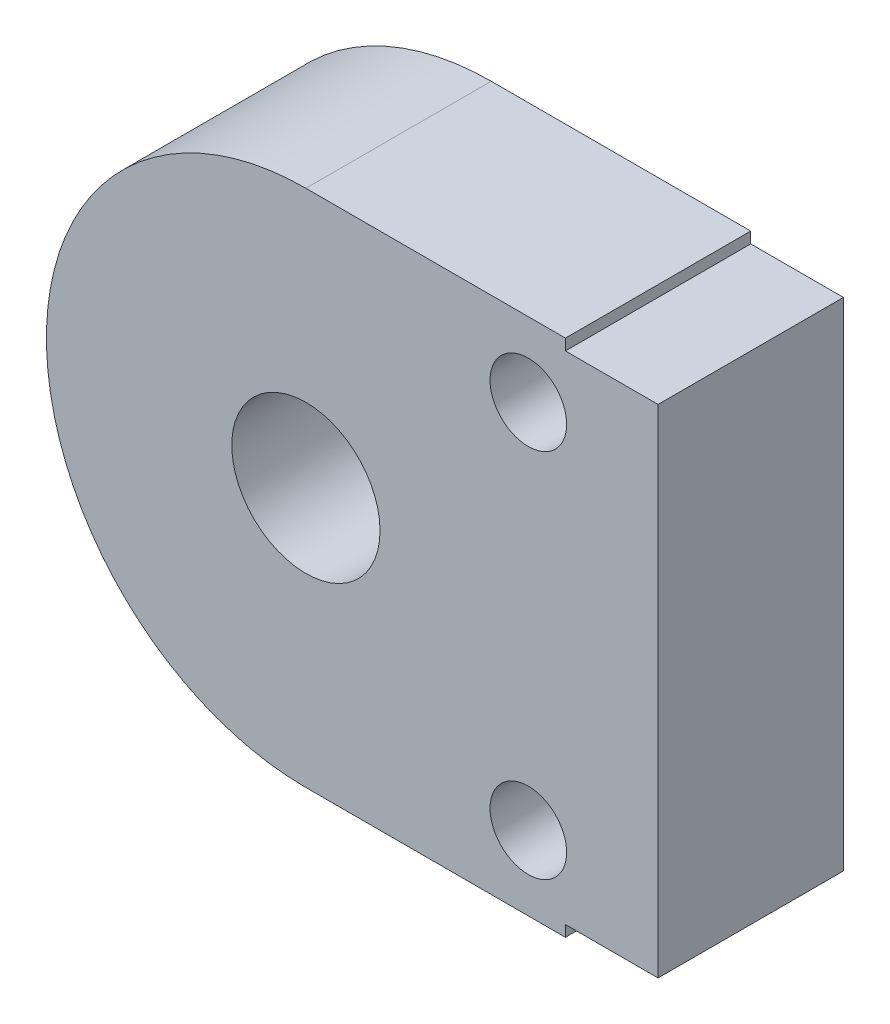
ISO-10303-21;
HEADER;
FILE_DESCRIPTION(('STEP AP214'),'2;1');
FILE_NAME('part.step','',(''),(''),'','','');
FILE_SCHEMA(('AUTOMOTIVE_DESIGN { 1 0 10303 214 1 1 1 1 }'));
ENDSEC;
DATA;
#1=APPLICATION_CONTEXT('core data for automotive mechanical design processes');
#2=APPLICATION_PROTOCOL_DEFINITION('international standard','automotive_design',2000,#1);
#3=PRODUCT_CONTEXT('',#1,'mechanical');
#4=PRODUCT('Part','Part','',(#3));
#5=PRODUCT_RELATED_PRODUCT_CATEGORY('part','',(#4));
#6=PRODUCT_DEFINITION_FORMATION('','',#4);
#7=PRODUCT_DEFINITION_CONTEXT('part definition',#1,'design');
#8=PRODUCT_DEFINITION('design','',#6,#7);
#9=PRODUCT_DEFINITION_SHAPE('','',#8);
#10=(LENGTH_UNIT() NAMED_UNIT(*) SI_UNIT(.MILLI.,.METRE.));
#11=(NAMED_UNIT(*) PLANE_ANGLE_UNIT() SI_UNIT($,.RADIAN.));
#12=(NAMED_UNIT(*) SI_UNIT($,.STERADIAN.) SOLID_ANGLE_UNIT());
#13=UNCERTAINTY_MEASURE_WITH_UNIT(LENGTH_MEASURE(1.E-05),#10,'distance_accuracy_value','');
#14=(GEOMETRIC_REPRESENTATION_CONTEXT(3) GLOBAL_UNCERTAINTY_ASSIGNED_CONTEXT((#13)) GLOBAL_UNIT_ASSIGNED_CONTEXT((#10,
#11,#12)) REPRESENTATION_CONTEXT('',''));
#15=CARTESIAN_POINT('',(0.,0.,0.));
#16=DIRECTION('',(0.,0.,1.));
#17=DIRECTION('',(1.,0.,0.));
#18=AXIS2_PLACEMENT_3D('',#15,#16,#17);
#19=CARTESIAN_POINT('',(0.,0.,-53.2781700167648));
#20=DIRECTION('',(0.,0.,1.));
#21=DIRECTION('',(1.,0.,0.));
#22=AXIS2_PLACEMENT_3D('',#19,#20,#21);
#23=CYLINDRICAL_SURFACE('',#22,14.);
#24=CARTESIAN_POINT('',(0.,0.,-10.));
#25=DIRECTION('',(0.,0.,1.));
#26=DIRECTION('',(1.,0.,0.));
#27=AXIS2_PLACEMENT_3D('',#24,#25,#26);
#28=CIRCLE('',#27,14.);
#29=CARTESIAN_POINT('',(0.,-14.,-10.));
#30=VERTEX_POINT('',#29);
#31=CARTESIAN_POINT('',(0.,14.,-10.));
#32=VERTEX_POINT('',#31);
#33=EDGE_CURVE('E23',#30,#32,#28,.F.);
#34=ORIENTED_EDGE('',*,*,#33,.F.);
#35=DIRECTION('',(0.,0.,1.));
#36=VECTOR('',#35,1.);
#37=CARTESIAN_POINT('',(0.,-14.,-53.2781700167648));
#38=LINE('',#37,#36);
#39=CARTESIAN_POINT('',(0.,-14.,0.));
#40=VERTEX_POINT('',#39);
#41=EDGE_CURVE('E81',#30,#40,#38,.T.);
#42=ORIENTED_EDGE('',*,*,#41,.T.);
#43=CARTESIAN_POINT('',(0.,0.,0.));
#44=DIRECTION('',(0.,0.,1.));
#45=DIRECTION('',(1.,0.,0.));
#46=AXIS2_PLACEMENT_3D('',#43,#44,#45);
#47=CIRCLE('',#46,14.);
#48=CARTESIAN_POINT('',(0.,14.,0.));
#49=VERTEX_POINT('',#48);
#50=EDGE_CURVE('E84',#49,#40,#47,.T.);
#51=ORIENTED_EDGE('',*,*,#50,.F.);
#52=DIRECTION('',(0.,0.,1.));
#53=VECTOR('',#52,1.);
#54=CARTESIAN_POINT('',(0.,14.,-53.2781700167648));
#55=LINE('',#54,#53);
#56=EDGE_CURVE('E57',#32,#49,#55,.T.);
#57=ORIENTED_EDGE('',*,*,#56,.F.);
#58=EDGE_LOOP('',(#34,#42,#51,#57));
#59=FACE_BOUND('',#58,.T.);
#60=ADVANCED_FACE('F15',(#59),#23,.T.);
#61=CARTESIAN_POINT('',(0.,14.,-53.2781700167648));
#62=DIRECTION('',(0.,1.,0.));
#63=DIRECTION('',(0.,0.,1.));
#64=AXIS2_PLACEMENT_3D('',#61,#62,#63);
#65=PLANE('',#64);
#66=DIRECTION('',(1.,0.,0.));
#67=VECTOR('',#66,1.);
#68=CARTESIAN_POINT('',(0.,14.,-10.));
#69=LINE('',#68,#67);
#70=CARTESIAN_POINT('',(14.,14.,-10.));
#71=VERTEX_POINT('',#70);
#72=EDGE_CURVE('E157',#32,#71,#69,.T.);
#73=ORIENTED_EDGE('',*,*,#72,.F.);
#74=ORIENTED_EDGE('',*,*,#56,.T.);
#75=DIRECTION('',(-1.,0.,0.));
#76=VECTOR('',#75,1.);
#77=CARTESIAN_POINT('',(0.,14.,0.));
#78=LINE('',#77,#76);
#79=CARTESIAN_POINT('',(14.,14.,0.));
#80=VERTEX_POINT('',#79);
#81=EDGE_CURVE('E88',#80,#49,#78,.T.);
#82=ORIENTED_EDGE('',*,*,#81,.F.);
#83=DIRECTION('',(0.,0.,1.));
#84=VECTOR('',#83,1.);
#85=CARTESIAN_POINT('',(14.,14.,-53.2781700167648));
#86=LINE('',#85,#84);
#87=EDGE_CURVE('E121',#71,#80,#86,.T.);
#88=ORIENTED_EDGE('',*,*,#87,.F.);
#89=EDGE_LOOP('',(#73,#74,#82,#88));
#90=FACE_BOUND('',#89,.T.);
#91=ADVANCED_FACE('F156',(#90),#65,.T.);
#92=CARTESIAN_POINT('',(14.,14.,-53.2781700167648));
#93=DIRECTION('',(1.,0.,0.));
#94=DIRECTION('',(0.,1.,0.));
#95=AXIS2_PLACEMENT_3D('',#92,#93,#94);
#96=PLANE('',#95);
#97=DIRECTION('',(0.,-1.,0.));
#98=VECTOR('',#97,1.);
#99=CARTESIAN_POINT('',(14.,14.,-10.));
#100=LINE('',#99,#98);
#101=CARTESIAN_POINT('',(14.,13.4,-10.));
#102=VERTEX_POINT('',#101);
#103=EDGE_CURVE('E158',#71,#102,#100,.T.);
#104=ORIENTED_EDGE('',*,*,#103,.F.);
#105=ORIENTED_EDGE('',*,*,#87,.T.);
#106=DIRECTION('',(0.,1.,0.));
#107=VECTOR('',#106,1.);
#108=CARTESIAN_POINT('',(14.,14.,0.));
#109=LINE('',#108,#107);
#110=CARTESIAN_POINT('',(14.,13.4,0.));
#111=VERTEX_POINT('',#110);
#112=EDGE_CURVE('E117',#111,#80,#109,.T.);
#113=ORIENTED_EDGE('',*,*,#112,.F.);
#114=DIRECTION('',(0.,0.,1.));
#115=VECTOR('',#114,1.);
#116=CARTESIAN_POINT('',(14.,13.4,-53.2781700167648));
#117=LINE('',#116,#115);
#118=EDGE_CURVE('E123',#102,#111,#117,.T.);
#119=ORIENTED_EDGE('',*,*,#118,.F.);
#120=EDGE_LOOP('',(#104,#105,#113,#119));
#121=FACE_BOUND('',#120,.T.);
#122=ADVANCED_FACE('F154',(#121),#96,.T.);
#123=CARTESIAN_POINT('',(14.,13.4,-53.2781700167648));
#124=DIRECTION('',(0.,1.,0.));
#125=DIRECTION('',(0.,0.,1.));
#126=AXIS2_PLACEMENT_3D('',#123,#124,#125);
#127=PLANE('',#126);
#128=DIRECTION('',(1.,0.,0.));
#129=VECTOR('',#128,1.);
#130=CARTESIAN_POINT('',(14.,13.4,-10.));
#131=LINE('',#130,#129);
#132=CARTESIAN_POINT('',(19.,13.4,-10.));
#133=VERTEX_POINT('',#132);
#134=EDGE_CURVE('E151',#102,#133,#131,.T.);
#135=ORIENTED_EDGE('',*,*,#134,.F.);
#136=ORIENTED_EDGE('',*,*,#118,.T.);
#137=DIRECTION('',(-1.,0.,0.));
#138=VECTOR('',#137,1.);
#139=CARTESIAN_POINT('',(14.,13.4,0.));
#140=LINE('',#139,#138);
#141=CARTESIAN_POINT('',(19.,13.4,0.));
#142=VERTEX_POINT('',#141);
#143=EDGE_CURVE('E114',#142,#111,#140,.T.);
#144=ORIENTED_EDGE('',*,*,#143,.F.);
#145=DIRECTION('',(0.,0.,1.));
#146=VECTOR('',#145,1.);
#147=CARTESIAN_POINT('',(19.,13.4,-53.2781700167648));
#148=LINE('',#147,#146);
#149=EDGE_CURVE('E125',#133,#142,#148,.T.);
#150=ORIENTED_EDGE('',*,*,#149,.F.);
#151=EDGE_LOOP('',(#135,#136,#144,#150));
#152=FACE_BOUND('',#151,.T.);
#153=ADVANCED_FACE('F148',(#152),#127,.T.);
#154=CARTESIAN_POINT('',(19.,13.4,-53.2781700167648));
#155=DIRECTION('',(1.,0.,0.));
#156=DIRECTION('',(0.,0.,-1.));
#157=AXIS2_PLACEMENT_3D('',#154,#155,#156);
#158=PLANE('',#157);
#159=DIRECTION('',(0.,-1.,0.));
#160=VECTOR('',#159,1.);
#161=CARTESIAN_POINT('',(19.,13.4,-10.));
#162=LINE('',#161,#160);
#163=CARTESIAN_POINT('',(19.,-13.4,-10.));
#164=VERTEX_POINT('',#163);
#165=EDGE_CURVE('E145',#133,#164,#162,.T.);
#166=ORIENTED_EDGE('',*,*,#165,.F.);
#167=ORIENTED_EDGE('',*,*,#149,.T.);
#168=DIRECTION('',(0.,1.,0.));
#169=VECTOR('',#168,1.);
#170=CARTESIAN_POINT('',(19.,13.4,0.));
#171=LINE('',#170,#169);
#172=CARTESIAN_POINT('',(19.,-13.4,0.));
#173=VERTEX_POINT('',#172);
#174=EDGE_CURVE('E111',#173,#142,#171,.T.);
#175=ORIENTED_EDGE('',*,*,#174,.F.);
#176=DIRECTION('',(0.,0.,1.));
#177=VECTOR('',#176,1.);
#178=CARTESIAN_POINT('',(19.,-13.4,-53.2781700167648));
#179=LINE('',#178,#177);
#180=EDGE_CURVE('E127',#164,#173,#179,.T.);
#181=ORIENTED_EDGE('',*,*,#180,.F.);
#182=EDGE_LOOP('',(#166,#167,#175,#181));
#183=FACE_BOUND('',#182,.T.);
#184=ADVANCED_FACE('F143',(#183),#158,.T.);
#185=CARTESIAN_POINT('',(14.,-13.4,-53.2781700167648));
#186=DIRECTION('',(0.,-1.,0.));
#187=DIRECTION('',(0.,0.,-1.));
#188=AXIS2_PLACEMENT_3D('',#185,#186,#187);
#189=PLANE('',#188);
#190=DIRECTION('',(-1.,0.,0.));
#191=VECTOR('',#190,1.);
#192=CARTESIAN_POINT('',(14.,-13.4,-10.));
#193=LINE('',#192,#191);
#194=CARTESIAN_POINT('',(14.,-13.4,-10.));
#195=VERTEX_POINT('',#194);
#196=EDGE_CURVE('E163',#164,#195,#193,.T.);
#197=ORIENTED_EDGE('',*,*,#196,.F.);
#198=ORIENTED_EDGE('',*,*,#180,.T.);
#199=DIRECTION('',(1.,0.,0.));
#200=VECTOR('',#199,1.);
#201=CARTESIAN_POINT('',(14.,-13.4,0.));
#202=LINE('',#201,#200);
#203=CARTESIAN_POINT('',(14.,-13.4,0.));
#204=VERTEX_POINT('',#203);
#205=EDGE_CURVE('E108',#204,#173,#202,.T.);
#206=ORIENTED_EDGE('',*,*,#205,.F.);
#207=DIRECTION('',(0.,0.,1.));
#208=VECTOR('',#207,1.);
#209=CARTESIAN_POINT('',(14.,-13.4,-53.2781700167648));
#210=LINE('',#209,#208);
#211=EDGE_CURVE('E129',#195,#204,#210,.T.);
#212=ORIENTED_EDGE('',*,*,#211,.F.);
#213=EDGE_LOOP('',(#197,#198,#206,#212));
#214=FACE_BOUND('',#213,.T.);
#215=ADVANCED_FACE('F137',(#214),#189,.T.);
#216=CARTESIAN_POINT('',(14.,-14.,-53.2781700167648));
#217=DIRECTION('',(1.,0.,0.));
#218=DIRECTION('',(0.,0.,-1.));
#219=AXIS2_PLACEMENT_3D('',#216,#217,#218);
#220=PLANE('',#219);
#221=DIRECTION('',(0.,-1.,0.));
#222=VECTOR('',#221,1.);
#223=CARTESIAN_POINT('',(14.,-14.,-10.));
#224=LINE('',#223,#222);
#225=CARTESIAN_POINT('',(14.,-14.,-10.));
#226=VERTEX_POINT('',#225);
#227=EDGE_CURVE('E50',#195,#226,#224,.T.);
#228=ORIENTED_EDGE('',*,*,#227,.F.);
#229=ORIENTED_EDGE('',*,*,#211,.T.);
#230=DIRECTION('',(0.,1.,0.));
#231=VECTOR('',#230,1.);
#232=CARTESIAN_POINT('',(14.,-14.,0.));
#233=LINE('',#232,#231);
#234=CARTESIAN_POINT('',(14.,-14.,0.));
#235=VERTEX_POINT('',#234);
#236=EDGE_CURVE('E95',#235,#204,#233,.T.);
#237=ORIENTED_EDGE('',*,*,#236,.F.);
#238=DIRECTION('',(0.,0.,1.));
#239=VECTOR('',#238,1.);
#240=CARTESIAN_POINT('',(14.,-14.,-53.2781700167648));
#241=LINE('',#240,#239);
#242=EDGE_CURVE('E87',#226,#235,#241,.T.);
#243=ORIENTED_EDGE('',*,*,#242,.F.);
#244=EDGE_LOOP('',(#228,#229,#237,#243));
#245=FACE_BOUND('',#244,.T.);
#246=ADVANCED_FACE('F134',(#245),#220,.T.);
#247=CARTESIAN_POINT('',(0.,-14.,-53.2781700167648));
#248=DIRECTION('',(0.,-1.,0.));
#249=DIRECTION('',(0.,0.,-1.));
#250=AXIS2_PLACEMENT_3D('',#247,#248,#249);
#251=PLANE('',#250);
#252=DIRECTION('',(-1.,0.,0.));
#253=VECTOR('',#252,1.);
#254=CARTESIAN_POINT('',(0.,-14.,-10.));
#255=LINE('',#254,#253);
#256=EDGE_CURVE('E10',#226,#30,#255,.T.);
#257=ORIENTED_EDGE('',*,*,#256,.F.);
#258=ORIENTED_EDGE('',*,*,#242,.T.);
#259=DIRECTION('',(1.,0.,0.));
#260=VECTOR('',#259,1.);
#261=CARTESIAN_POINT('',(0.,-14.,0.));
#262=LINE('',#261,#260);
#263=EDGE_CURVE('E90',#40,#235,#262,.T.);
#264=ORIENTED_EDGE('',*,*,#263,.F.);
#265=ORIENTED_EDGE('',*,*,#41,.F.);
#266=EDGE_LOOP('',(#257,#258,#264,#265));
#267=FACE_BOUND('',#266,.T.);
#268=ADVANCED_FACE('F91',(#267),#251,.T.);
#269=CARTESIAN_POINT('',(0.,0.,0.));
#270=DIRECTION('',(0.,0.,1.));
#271=DIRECTION('',(1.,0.,0.));
#272=AXIS2_PLACEMENT_3D('',#269,#270,#271);
#273=PLANE('',#272);
#274=CARTESIAN_POINT('',(12.,10.,0.));
#275=DIRECTION('',(0.,0.,-1.));
#276=DIRECTION('',(-1.,0.,0.));
#277=AXIS2_PLACEMENT_3D('',#274,#275,#276);
#278=CIRCLE('',#277,2.067);
#279=CARTESIAN_POINT('',(9.933,10.,0.));
#280=VERTEX_POINT('',#279);
#281=EDGE_CURVE('E174',#280,#280,#278,.T.);
#282=ORIENTED_EDGE('',*,*,#281,.T.);
#283=EDGE_LOOP('',(#282));
#284=FACE_BOUND('',#283,.T.);
#285=CARTESIAN_POINT('',(12.,-10.,0.));
#286=DIRECTION('',(0.,0.,-1.));
#287=DIRECTION('',(-1.,0.,0.));
#288=AXIS2_PLACEMENT_3D('',#285,#286,#287);
#289=CIRCLE('',#288,2.067);
#290=CARTESIAN_POINT('',(9.933,-10.,0.));
#291=VERTEX_POINT('',#290);
#292=EDGE_CURVE('E167',#291,#291,#289,.T.);
#293=ORIENTED_EDGE('',*,*,#292,.T.);
#294=EDGE_LOOP('',(#293));
#295=FACE_BOUND('',#294,.T.);
#296=CARTESIAN_POINT('',(0.,0.,0.));
#297=DIRECTION('',(0.,0.,1.));
#298=DIRECTION('',(1.,0.,0.));
#299=AXIS2_PLACEMENT_3D('',#296,#297,#298);
#300=CIRCLE('',#299,4.);
#301=CARTESIAN_POINT('',(4.,0.,0.));
#302=VERTEX_POINT('',#301);
#303=EDGE_CURVE('E102',#302,#302,#300,.T.);
#304=ORIENTED_EDGE('',*,*,#303,.F.);
#305=EDGE_LOOP('',(#304));
#306=FACE_BOUND('',#305,.T.);
#307=ORIENTED_EDGE('',*,*,#50,.T.);
#308=ORIENTED_EDGE('',*,*,#263,.T.);
#309=ORIENTED_EDGE('',*,*,#236,.T.);
#310=ORIENTED_EDGE('',*,*,#205,.T.);
#311=ORIENTED_EDGE('',*,*,#174,.T.);
#312=ORIENTED_EDGE('',*,*,#143,.T.);
#313=ORIENTED_EDGE('',*,*,#112,.T.);
#314=ORIENTED_EDGE('',*,*,#81,.T.);
#315=EDGE_LOOP('',(#307,#308,#309,#310,#311,#312,#313,#314));
#316=FACE_BOUND('',#315,.T.);
#317=ADVANCED_FACE('F97',(#284,#295,#306,#316),#273,.T.);
#318=CARTESIAN_POINT('',(0.,0.,-10.));
#319=DIRECTION('',(0.,0.,1.));
#320=DIRECTION('',(1.,0.,0.));
#321=AXIS2_PLACEMENT_3D('',#318,#319,#320);
#322=PLANE('',#321);
#323=CARTESIAN_POINT('',(12.,10.,-10.));
#324=DIRECTION('',(0.,0.,-1.));
#325=DIRECTION('',(-1.,0.,0.));
#326=AXIS2_PLACEMENT_3D('',#323,#324,#325);
#327=CIRCLE('',#326,2.06699999999999);
#328=CARTESIAN_POINT('',(9.93300000000001,10.,-10.));
#329=VERTEX_POINT('',#328);
#330=EDGE_CURVE('E177',#329,#329,#327,.T.);
#331=ORIENTED_EDGE('',*,*,#330,.F.);
#332=EDGE_LOOP('',(#331));
#333=FACE_BOUND('',#332,.T.);
#334=CARTESIAN_POINT('',(12.,-10.,-10.));
#335=DIRECTION('',(0.,0.,-1.));
#336=DIRECTION('',(-1.,0.,0.));
#337=AXIS2_PLACEMENT_3D('',#334,#335,#336);
#338=CIRCLE('',#337,2.06699999999999);
#339=CARTESIAN_POINT('',(9.93300000000001,-10.,-10.));
#340=VERTEX_POINT('',#339);
#341=EDGE_CURVE('E171',#340,#340,#338,.T.);
#342=ORIENTED_EDGE('',*,*,#341,.F.);
#343=EDGE_LOOP('',(#342));
#344=FACE_BOUND('',#343,.T.);
#345=CARTESIAN_POINT('',(0.,0.,-10.));
#346=DIRECTION('',(0.,0.,1.));
#347=DIRECTION('',(1.,0.,0.));
#348=AXIS2_PLACEMENT_3D('',#345,#346,#347);
#349=CIRCLE('',#348,4.);
#350=CARTESIAN_POINT('',(4.,0.,-10.));
#351=VERTEX_POINT('',#350);
#352=EDGE_CURVE('E99',#351,#351,#349,.T.);
#353=ORIENTED_EDGE('',*,*,#352,.T.);
#354=EDGE_LOOP('',(#353));
#355=FACE_BOUND('',#354,.T.);
#356=ORIENTED_EDGE('',*,*,#33,.T.);
#357=ORIENTED_EDGE('',*,*,#72,.T.);
#358=ORIENTED_EDGE('',*,*,#103,.T.);
#359=ORIENTED_EDGE('',*,*,#134,.T.);
#360=ORIENTED_EDGE('',*,*,#165,.T.);
#361=ORIENTED_EDGE('',*,*,#196,.T.);
#362=ORIENTED_EDGE('',*,*,#227,.T.);
#363=ORIENTED_EDGE('',*,*,#256,.T.);
#364=EDGE_LOOP('',(#356,#357,#358,#359,#360,#361,#362,#363));
#365=FACE_BOUND('',#364,.T.);
#366=ADVANCED_FACE('F183',(#333,#344,#355,#365),#322,.F.);
#367=CARTESIAN_POINT('',(0.,0.,-10.));
#368=DIRECTION('',(0.,0.,1.));
#369=DIRECTION('',(1.,0.,0.));
#370=AXIS2_PLACEMENT_3D('',#367,#368,#369);
#371=CYLINDRICAL_SURFACE('',#370,4.);
#372=ORIENTED_EDGE('',*,*,#352,.F.);
#373=EDGE_LOOP('',(#372));
#374=FACE_BOUND('',#373,.T.);
#375=ORIENTED_EDGE('',*,*,#303,.T.);
#376=EDGE_LOOP('',(#375));
#377=FACE_BOUND('',#376,.T.);
#378=ADVANCED_FACE('F186',(#374,#377),#371,.F.);
#379=CARTESIAN_POINT('',(12.,-10.,-10.));
#380=DIRECTION('',(0.,0.,-1.));
#381=DIRECTION('',(-1.,0.,0.));
#382=AXIS2_PLACEMENT_3D('',#379,#380,#381);
#383=CYLINDRICAL_SURFACE('',#382,2.06699999999999);
#384=ORIENTED_EDGE('',*,*,#292,.F.);
#385=EDGE_LOOP('',(#384));
#386=FACE_BOUND('',#385,.T.);
#387=ORIENTED_EDGE('',*,*,#341,.T.);
#388=EDGE_LOOP('',(#387));
#389=FACE_BOUND('',#388,.T.);
#390=ADVANCED_FACE('F194',(#386,#389),#383,.F.);
#391=CARTESIAN_POINT('',(12.,10.,-10.));
#392=DIRECTION('',(0.,0.,-1.));
#393=DIRECTION('',(-1.,0.,0.));
#394=AXIS2_PLACEMENT_3D('',#391,#392,#393);
#395=CYLINDRICAL_SURFACE('',#394,2.06699999999999);
#396=ORIENTED_EDGE('',*,*,#281,.F.);
#397=EDGE_LOOP('',(#396));
#398=FACE_BOUND('',#397,.T.);
#399=ORIENTED_EDGE('',*,*,#330,.T.);
#400=EDGE_LOOP('',(#399));
#401=FACE_BOUND('',#400,.T.);
#402=ADVANCED_FACE('F181',(#398,#401),#395,.F.);
#403=CLOSED_SHELL('',(#60,#91,#122,#153,#184,#215,#246,#268,#317,#366,#378,#390,#402));
#404=MANIFOLD_SOLID_BREP('B1',#403);
#405=ADVANCED_BREP_SHAPE_REPRESENTATION('',(#18,#404),#14);
#406=SHAPE_DEFINITION_REPRESENTATION(#9,#405);
ENDSEC;
END-ISO-10303-21;
